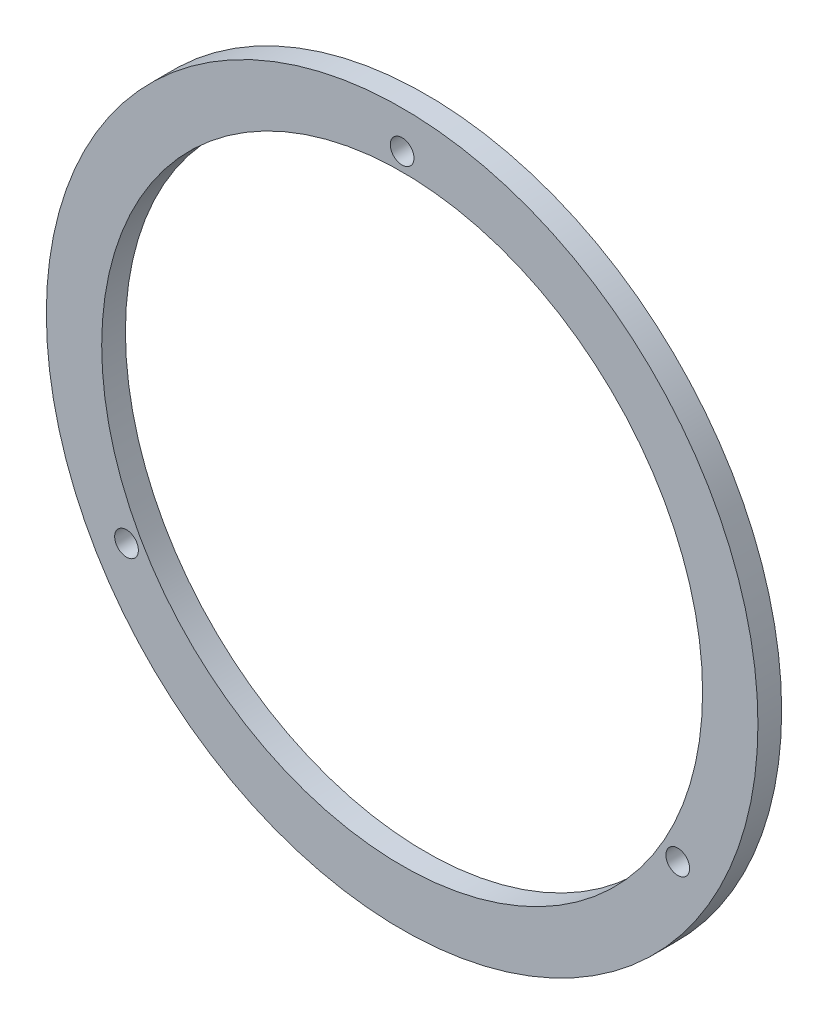
ISO-10303-21;
HEADER;
FILE_DESCRIPTION(('STEP AP214'),'2;1');
FILE_NAME('part.step','',(''),(''),'','','');
FILE_SCHEMA(('AUTOMOTIVE_DESIGN { 1 0 10303 214 1 1 1 1 }'));
ENDSEC;
DATA;
#1=APPLICATION_CONTEXT('core data for automotive mechanical design processes');
#2=APPLICATION_PROTOCOL_DEFINITION('international standard','automotive_design',2000,#1);
#3=PRODUCT_CONTEXT('',#1,'mechanical');
#4=PRODUCT('Part','Part','',(#3));
#5=PRODUCT_RELATED_PRODUCT_CATEGORY('part','',(#4));
#6=PRODUCT_DEFINITION_FORMATION('','',#4);
#7=PRODUCT_DEFINITION_CONTEXT('part definition',#1,'design');
#8=PRODUCT_DEFINITION('design','',#6,#7);
#9=PRODUCT_DEFINITION_SHAPE('','',#8);
#10=(LENGTH_UNIT() NAMED_UNIT(*) SI_UNIT(.MILLI.,.METRE.));
#11=(NAMED_UNIT(*) PLANE_ANGLE_UNIT() SI_UNIT($,.RADIAN.));
#12=(NAMED_UNIT(*) SI_UNIT($,.STERADIAN.) SOLID_ANGLE_UNIT());
#13=UNCERTAINTY_MEASURE_WITH_UNIT(LENGTH_MEASURE(1.E-05),#10,'distance_accuracy_value','');
#14=(GEOMETRIC_REPRESENTATION_CONTEXT(3) GLOBAL_UNCERTAINTY_ASSIGNED_CONTEXT((#13)) GLOBAL_UNIT_ASSIGNED_CONTEXT((#10,
#11,#12)) REPRESENTATION_CONTEXT('',''));
#15=CARTESIAN_POINT('',(0.,0.,0.));
#16=DIRECTION('',(0.,0.,1.));
#17=DIRECTION('',(1.,0.,0.));
#18=AXIS2_PLACEMENT_3D('',#15,#16,#17);
#19=CARTESIAN_POINT('',(0.,0.,3.));
#20=DIRECTION('',(0.,0.,1.));
#21=DIRECTION('',(1.,0.,0.));
#22=AXIS2_PLACEMENT_3D('',#19,#20,#21);
#23=PLANE('',#22);
#24=CARTESIAN_POINT('',(34.8575225023237,-20.125,3.));
#25=DIRECTION('',(0.,0.,1.));
#26=DIRECTION('',(1.,0.,0.));
#27=AXIS2_PLACEMENT_3D('',#24,#25,#26);
#28=CIRCLE('',#27,1.5);
#29=CARTESIAN_POINT('',(36.3575225023237,-20.125,3.));
#30=VERTEX_POINT('',#29);
#31=EDGE_CURVE('E37',#30,#30,#28,.T.);
#32=ORIENTED_EDGE('',*,*,#31,.F.);
#33=EDGE_LOOP('',(#32));
#34=FACE_BOUND('',#33,.T.);
#35=CARTESIAN_POINT('',(0.,0.,3.));
#36=DIRECTION('',(0.,0.,1.));
#37=DIRECTION('',(1.,0.,0.));
#38=AXIS2_PLACEMENT_3D('',#35,#36,#37);
#39=CIRCLE('',#38,38.);
#40=CARTESIAN_POINT('',(38.,0.,3.));
#41=VERTEX_POINT('',#40);
#42=EDGE_CURVE('E26',#41,#41,#39,.T.);
#43=ORIENTED_EDGE('',*,*,#42,.F.);
#44=EDGE_LOOP('',(#43));
#45=FACE_BOUND('',#44,.T.);
#46=CARTESIAN_POINT('',(0.,0.,3.));
#47=DIRECTION('',(0.,0.,1.));
#48=DIRECTION('',(1.,0.,0.));
#49=AXIS2_PLACEMENT_3D('',#46,#47,#48);
#50=CIRCLE('',#49,45.);
#51=CARTESIAN_POINT('',(45.,0.,3.));
#52=VERTEX_POINT('',#51);
#53=EDGE_CURVE('E10',#52,#52,#50,.T.);
#54=ORIENTED_EDGE('',*,*,#53,.T.);
#55=EDGE_LOOP('',(#54));
#56=FACE_BOUND('',#55,.T.);
#57=CARTESIAN_POINT('',(0.,40.25,3.));
#58=DIRECTION('',(0.,0.,1.));
#59=DIRECTION('',(1.,0.,0.));
#60=AXIS2_PLACEMENT_3D('',#57,#58,#59);
#61=CIRCLE('',#60,1.5);
#62=CARTESIAN_POINT('',(1.5,40.25,3.));
#63=VERTEX_POINT('',#62);
#64=EDGE_CURVE('E31',#63,#63,#61,.T.);
#65=ORIENTED_EDGE('',*,*,#64,.F.);
#66=EDGE_LOOP('',(#65));
#67=FACE_BOUND('',#66,.T.);
#68=CARTESIAN_POINT('',(-34.8575225023237,-20.125,3.));
#69=DIRECTION('',(0.,0.,1.));
#70=DIRECTION('',(1.,0.,0.));
#71=AXIS2_PLACEMENT_3D('',#68,#69,#70);
#72=CIRCLE('',#71,1.5);
#73=CARTESIAN_POINT('',(-33.3575225023237,-20.125,3.));
#74=VERTEX_POINT('',#73);
#75=EDGE_CURVE('E43',#74,#74,#72,.T.);
#76=ORIENTED_EDGE('',*,*,#75,.F.);
#77=EDGE_LOOP('',(#76));
#78=FACE_BOUND('',#77,.T.);
#79=ADVANCED_FACE('F15',(#34,#45,#56,#67,#78),#23,.T.);
#80=CARTESIAN_POINT('',(0.,0.,0.));
#81=DIRECTION('',(0.,0.,1.));
#82=DIRECTION('',(1.,0.,0.));
#83=AXIS2_PLACEMENT_3D('',#80,#81,#82);
#84=PLANE('',#83);
#85=CARTESIAN_POINT('',(0.,0.,0.));
#86=DIRECTION('',(0.,0.,1.));
#87=DIRECTION('',(1.,0.,0.));
#88=AXIS2_PLACEMENT_3D('',#85,#86,#87);
#89=CIRCLE('',#88,45.);
#90=CARTESIAN_POINT('',(45.,0.,0.));
#91=VERTEX_POINT('',#90);
#92=EDGE_CURVE('E19',#91,#91,#89,.T.);
#93=ORIENTED_EDGE('',*,*,#92,.F.);
#94=EDGE_LOOP('',(#93));
#95=FACE_BOUND('',#94,.T.);
#96=CARTESIAN_POINT('',(0.,0.,0.));
#97=DIRECTION('',(0.,0.,1.));
#98=DIRECTION('',(1.,0.,0.));
#99=AXIS2_PLACEMENT_3D('',#96,#97,#98);
#100=CIRCLE('',#99,38.);
#101=CARTESIAN_POINT('',(38.,0.,0.));
#102=VERTEX_POINT('',#101);
#103=EDGE_CURVE('E28',#102,#102,#100,.T.);
#104=ORIENTED_EDGE('',*,*,#103,.T.);
#105=EDGE_LOOP('',(#104));
#106=FACE_BOUND('',#105,.T.);
#107=CARTESIAN_POINT('',(0.,40.25,0.));
#108=DIRECTION('',(0.,0.,1.));
#109=DIRECTION('',(1.,0.,0.));
#110=AXIS2_PLACEMENT_3D('',#107,#108,#109);
#111=CIRCLE('',#110,1.5);
#112=CARTESIAN_POINT('',(1.5,40.25,0.));
#113=VERTEX_POINT('',#112);
#114=EDGE_CURVE('E34',#113,#113,#111,.T.);
#115=ORIENTED_EDGE('',*,*,#114,.T.);
#116=EDGE_LOOP('',(#115));
#117=FACE_BOUND('',#116,.T.);
#118=CARTESIAN_POINT('',(34.8575225023237,-20.125,0.));
#119=DIRECTION('',(0.,0.,1.));
#120=DIRECTION('',(1.,0.,0.));
#121=AXIS2_PLACEMENT_3D('',#118,#119,#120);
#122=CIRCLE('',#121,1.5);
#123=CARTESIAN_POINT('',(36.3575225023237,-20.125,0.));
#124=VERTEX_POINT('',#123);
#125=EDGE_CURVE('E40',#124,#124,#122,.T.);
#126=ORIENTED_EDGE('',*,*,#125,.T.);
#127=EDGE_LOOP('',(#126));
#128=FACE_BOUND('',#127,.T.);
#129=CARTESIAN_POINT('',(-34.8575225023237,-20.125,0.));
#130=DIRECTION('',(0.,0.,1.));
#131=DIRECTION('',(1.,0.,0.));
#132=AXIS2_PLACEMENT_3D('',#129,#130,#131);
#133=CIRCLE('',#132,1.5);
#134=CARTESIAN_POINT('',(-33.3575225023237,-20.125,0.));
#135=VERTEX_POINT('',#134);
#136=EDGE_CURVE('E46',#135,#135,#133,.T.);
#137=ORIENTED_EDGE('',*,*,#136,.T.);
#138=EDGE_LOOP('',(#137));
#139=FACE_BOUND('',#138,.T.);
#140=ADVANCED_FACE('F56',(#95,#106,#117,#128,#139),#84,.F.);
#141=CARTESIAN_POINT('',(0.,0.,3.));
#142=DIRECTION('',(0.,0.,-1.));
#143=DIRECTION('',(-1.,0.,0.));
#144=AXIS2_PLACEMENT_3D('',#141,#142,#143);
#145=CYLINDRICAL_SURFACE('',#144,45.);
#146=ORIENTED_EDGE('',*,*,#53,.F.);
#147=EDGE_LOOP('',(#146));
#148=FACE_BOUND('',#147,.T.);
#149=ORIENTED_EDGE('',*,*,#92,.T.);
#150=EDGE_LOOP('',(#149));
#151=FACE_BOUND('',#150,.T.);
#152=ADVANCED_FACE('F17',(#148,#151),#145,.T.);
#153=CARTESIAN_POINT('',(0.,0.,3.));
#154=DIRECTION('',(0.,0.,-1.));
#155=DIRECTION('',(-1.,0.,0.));
#156=AXIS2_PLACEMENT_3D('',#153,#154,#155);
#157=CYLINDRICAL_SURFACE('',#156,38.);
#158=ORIENTED_EDGE('',*,*,#42,.T.);
#159=EDGE_LOOP('',(#158));
#160=FACE_BOUND('',#159,.T.);
#161=ORIENTED_EDGE('',*,*,#103,.F.);
#162=EDGE_LOOP('',(#161));
#163=FACE_BOUND('',#162,.T.);
#164=ADVANCED_FACE('F68',(#160,#163),#157,.F.);
#165=CARTESIAN_POINT('',(0.,40.25,3.));
#166=DIRECTION('',(0.,0.,-1.));
#167=DIRECTION('',(-1.,0.,0.));
#168=AXIS2_PLACEMENT_3D('',#165,#166,#167);
#169=CYLINDRICAL_SURFACE('',#168,1.5);
#170=ORIENTED_EDGE('',*,*,#64,.T.);
#171=EDGE_LOOP('',(#170));
#172=FACE_BOUND('',#171,.T.);
#173=ORIENTED_EDGE('',*,*,#114,.F.);
#174=EDGE_LOOP('',(#173));
#175=FACE_BOUND('',#174,.T.);
#176=ADVANCED_FACE('F71',(#172,#175),#169,.F.);
#177=CARTESIAN_POINT('',(34.8575225023237,-20.125,3.));
#178=DIRECTION('',(0.,0.,-1.));
#179=DIRECTION('',(-1.,0.,0.));
#180=AXIS2_PLACEMENT_3D('',#177,#178,#179);
#181=CYLINDRICAL_SURFACE('',#180,1.5);
#182=ORIENTED_EDGE('',*,*,#31,.T.);
#183=EDGE_LOOP('',(#182));
#184=FACE_BOUND('',#183,.T.);
#185=ORIENTED_EDGE('',*,*,#125,.F.);
#186=EDGE_LOOP('',(#185));
#187=FACE_BOUND('',#186,.T.);
#188=ADVANCED_FACE('F75',(#184,#187),#181,.F.);
#189=CARTESIAN_POINT('',(-34.8575225023237,-20.125,3.));
#190=DIRECTION('',(0.,0.,-1.));
#191=DIRECTION('',(-1.,0.,0.));
#192=AXIS2_PLACEMENT_3D('',#189,#190,#191);
#193=CYLINDRICAL_SURFACE('',#192,1.5);
#194=ORIENTED_EDGE('',*,*,#75,.T.);
#195=EDGE_LOOP('',(#194));
#196=FACE_BOUND('',#195,.T.);
#197=ORIENTED_EDGE('',*,*,#136,.F.);
#198=EDGE_LOOP('',(#197));
#199=FACE_BOUND('',#198,.T.);
#200=ADVANCED_FACE('F52',(#196,#199),#193,.F.);
#201=CLOSED_SHELL('',(#79,#140,#152,#164,#176,#188,#200));
#202=MANIFOLD_SOLID_BREP('B1',#201);
#203=ADVANCED_BREP_SHAPE_REPRESENTATION('',(#18,#202),#14);
#204=SHAPE_DEFINITION_REPRESENTATION(#9,#203);
ENDSEC;
END-ISO-10303-21;
